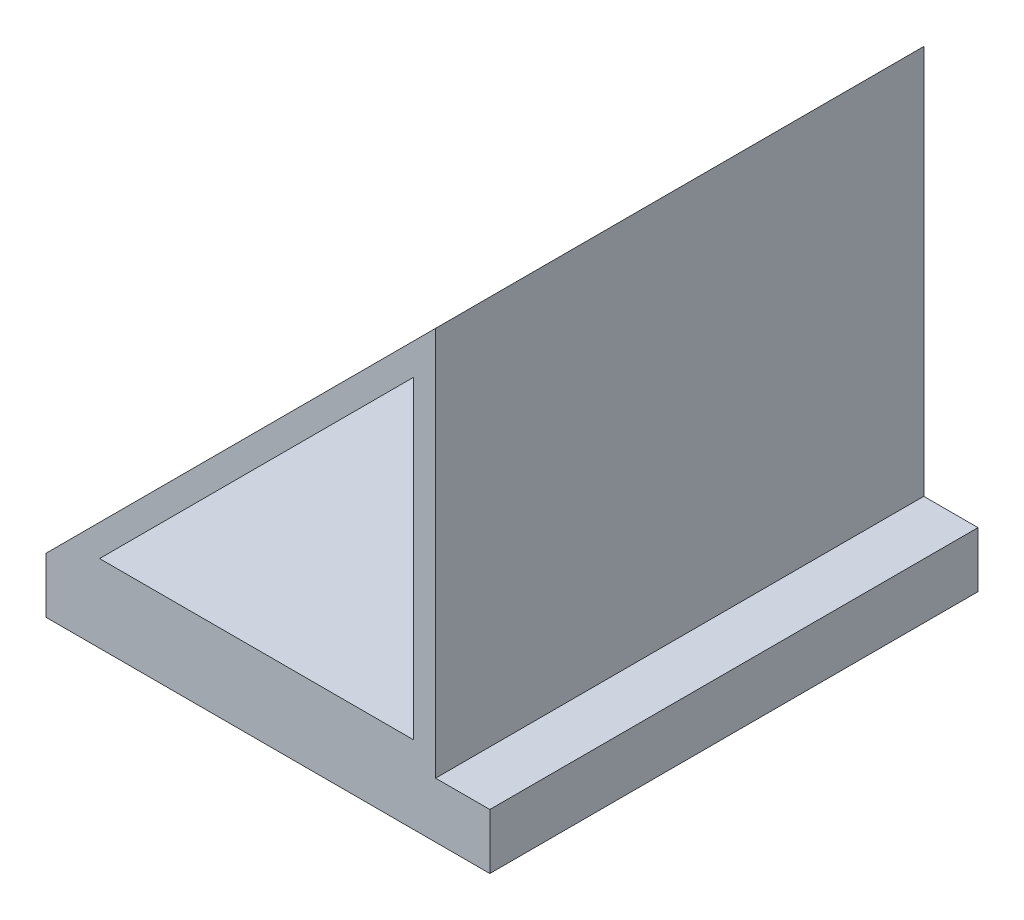
ISO-10303-21;
HEADER;
FILE_DESCRIPTION(('STEP AP214'),'2;1');
FILE_NAME('part.step','',(''),(''),'','','');
FILE_SCHEMA(('AUTOMOTIVE_DESIGN { 1 0 10303 214 1 1 1 1 }'));
ENDSEC;
DATA;
#1=APPLICATION_CONTEXT('core data for automotive mechanical design processes');
#2=APPLICATION_PROTOCOL_DEFINITION('international standard','automotive_design',2000,#1);
#3=PRODUCT_CONTEXT('',#1,'mechanical');
#4=PRODUCT('Part','Part','',(#3));
#5=PRODUCT_RELATED_PRODUCT_CATEGORY('part','',(#4));
#6=PRODUCT_DEFINITION_FORMATION('','',#4);
#7=PRODUCT_DEFINITION_CONTEXT('part definition',#1,'design');
#8=PRODUCT_DEFINITION('design','',#6,#7);
#9=PRODUCT_DEFINITION_SHAPE('','',#8);
#10=(LENGTH_UNIT() NAMED_UNIT(*) SI_UNIT(.MILLI.,.METRE.));
#11=(NAMED_UNIT(*) PLANE_ANGLE_UNIT() SI_UNIT($,.RADIAN.));
#12=(NAMED_UNIT(*) SI_UNIT($,.STERADIAN.) SOLID_ANGLE_UNIT());
#13=UNCERTAINTY_MEASURE_WITH_UNIT(LENGTH_MEASURE(1.E-05),#10,'distance_accuracy_value','');
#14=(GEOMETRIC_REPRESENTATION_CONTEXT(3) GLOBAL_UNCERTAINTY_ASSIGNED_CONTEXT((#13)) GLOBAL_UNIT_ASSIGNED_CONTEXT((#10,
#11,#12)) REPRESENTATION_CONTEXT('',''));
#15=CARTESIAN_POINT('',(0.,0.,0.));
#16=DIRECTION('',(0.,0.,1.));
#17=DIRECTION('',(1.,0.,0.));
#18=AXIS2_PLACEMENT_3D('',#15,#16,#17);
#19=CARTESIAN_POINT('',(0.,0.,44.));
#20=DIRECTION('',(0.,0.,-1.));
#21=DIRECTION('',(-1.,0.,0.));
#22=AXIS2_PLACEMENT_3D('',#19,#20,#21);
#23=PLANE('',#22);
#24=DIRECTION('',(0.,1.,0.));
#25=VECTOR('',#24,1.);
#26=CARTESIAN_POINT('',(2.,-30.2842712474621,44.));
#27=LINE('',#26,#25);
#28=CARTESIAN_POINT('',(2.,-30.2842712474621,44.));
#29=VERTEX_POINT('',#28);
#30=CARTESIAN_POINT('',(2.,4.82842712474623,44.));
#31=VERTEX_POINT('',#30);
#32=EDGE_CURVE('E194',#29,#31,#27,.T.);
#33=ORIENTED_EDGE('',*,*,#32,.T.);
#34=DIRECTION('',(-0.707106781186544,-0.707106781186551,0.));
#35=VECTOR('',#34,1.);
#36=CARTESIAN_POINT('',(2.,4.82842712474623,44.));
#37=LINE('',#36,#35);
#38=CARTESIAN_POINT('',(-33.1126983722079,-30.2842712474621,44.));
#39=VERTEX_POINT('',#38);
#40=EDGE_CURVE('E197',#31,#39,#37,.T.);
#41=ORIENTED_EDGE('',*,*,#40,.T.);
#42=DIRECTION('',(0.,1.,0.));
#43=VECTOR('',#42,1.);
#44=CARTESIAN_POINT('',(-33.1126983722079,-30.2842712474621,44.));
#45=LINE('',#44,#43);
#46=CARTESIAN_POINT('',(-33.1126983722079,-35.2842712474621,44.));
#47=VERTEX_POINT('',#46);
#48=EDGE_CURVE('E134',#47,#39,#45,.T.);
#49=ORIENTED_EDGE('',*,*,#48,.F.);
#50=DIRECTION('',(-1.,0.,0.));
#51=VECTOR('',#50,1.);
#52=CARTESIAN_POINT('',(-33.1126983722079,-35.2842712474621,44.));
#53=LINE('',#52,#51);
#54=CARTESIAN_POINT('',(6.8873016277921,-35.2842712474621,44.));
#55=VERTEX_POINT('',#54);
#56=EDGE_CURVE('E113',#55,#47,#53,.T.);
#57=ORIENTED_EDGE('',*,*,#56,.F.);
#58=DIRECTION('',(0.,-1.,0.));
#59=VECTOR('',#58,1.);
#60=CARTESIAN_POINT('',(6.8873016277921,-30.2842712474621,44.));
#61=LINE('',#60,#59);
#62=CARTESIAN_POINT('',(6.8873016277921,-30.2842712474621,44.));
#63=VERTEX_POINT('',#62);
#64=EDGE_CURVE('E144',#63,#55,#61,.T.);
#65=ORIENTED_EDGE('',*,*,#64,.F.);
#66=DIRECTION('',(1.,0.,0.));
#67=VECTOR('',#66,1.);
#68=CARTESIAN_POINT('',(-33.1126983722079,-30.2842712474621,44.));
#69=LINE('',#68,#67);
#70=EDGE_CURVE('E116',#29,#63,#69,.T.);
#71=ORIENTED_EDGE('',*,*,#70,.F.);
#72=EDGE_LOOP('',(#33,#41,#49,#57,#65,#71));
#73=FACE_BOUND('',#72,.T.);
#74=DIRECTION('',(0.,1.,0.));
#75=VECTOR('',#74,1.);
#76=CARTESIAN_POINT('',(0.,-28.2842712474621,44.));
#77=LINE('',#76,#75);
#78=CARTESIAN_POINT('',(0.,-28.2842712474621,44.));
#79=VERTEX_POINT('',#78);
#80=CARTESIAN_POINT('',(0.,0.,44.));
#81=VERTEX_POINT('',#80);
#82=EDGE_CURVE('E175',#79,#81,#77,.T.);
#83=ORIENTED_EDGE('',*,*,#82,.F.);
#84=DIRECTION('',(1.,0.,0.));
#85=VECTOR('',#84,1.);
#86=CARTESIAN_POINT('',(-28.2842712474617,-28.2842712474621,44.));
#87=LINE('',#86,#85);
#88=CARTESIAN_POINT('',(-28.2842712474617,-28.2842712474621,44.));
#89=VERTEX_POINT('',#88);
#90=EDGE_CURVE('E180',#89,#79,#87,.T.);
#91=ORIENTED_EDGE('',*,*,#90,.F.);
#92=DIRECTION('',(-0.707106781186544,-0.707106781186551,0.));
#93=VECTOR('',#92,1.);
#94=CARTESIAN_POINT('',(0.,0.,44.));
#95=LINE('',#94,#93);
#96=EDGE_CURVE('E177',#81,#89,#95,.T.);
#97=ORIENTED_EDGE('',*,*,#96,.F.);
#98=EDGE_LOOP('',(#83,#91,#97));
#99=FACE_BOUND('',#98,.T.);
#100=ADVANCED_FACE('F33',(#73,#99),#23,.F.);
#101=CARTESIAN_POINT('',(0.,0.,0.));
#102=DIRECTION('',(0.,0.,-1.));
#103=DIRECTION('',(-1.,0.,0.));
#104=AXIS2_PLACEMENT_3D('',#101,#102,#103);
#105=PLANE('',#104);
#106=DIRECTION('',(0.,1.,0.));
#107=VECTOR('',#106,1.);
#108=CARTESIAN_POINT('',(2.,-30.2842712474621,0.));
#109=LINE('',#108,#107);
#110=CARTESIAN_POINT('',(2.,-30.2842712474621,0.));
#111=VERTEX_POINT('',#110);
#112=CARTESIAN_POINT('',(2.,4.82842712474623,0.));
#113=VERTEX_POINT('',#112);
#114=EDGE_CURVE('E193',#111,#113,#109,.T.);
#115=ORIENTED_EDGE('',*,*,#114,.F.);
#116=DIRECTION('',(-1.,0.,0.));
#117=VECTOR('',#116,1.);
#118=CARTESIAN_POINT('',(-33.1126983722079,-30.2842712474621,0.));
#119=LINE('',#118,#117);
#120=CARTESIAN_POINT('',(6.8873016277921,-30.2842712474621,0.));
#121=VERTEX_POINT('',#120);
#122=EDGE_CURVE('E138',#121,#111,#119,.T.);
#123=ORIENTED_EDGE('',*,*,#122,.F.);
#124=DIRECTION('',(0.,1.,0.));
#125=VECTOR('',#124,1.);
#126=CARTESIAN_POINT('',(6.8873016277921,-30.2842712474621,0.));
#127=LINE('',#126,#125);
#128=CARTESIAN_POINT('',(6.8873016277921,-35.2842712474621,0.));
#129=VERTEX_POINT('',#128);
#130=EDGE_CURVE('E128',#129,#121,#127,.T.);
#131=ORIENTED_EDGE('',*,*,#130,.F.);
#132=DIRECTION('',(1.,0.,0.));
#133=VECTOR('',#132,1.);
#134=CARTESIAN_POINT('',(-33.1126983722079,-35.2842712474621,0.));
#135=LINE('',#134,#133);
#136=CARTESIAN_POINT('',(-33.1126983722079,-35.2842712474621,0.));
#137=VERTEX_POINT('',#136);
#138=EDGE_CURVE('E111',#137,#129,#135,.T.);
#139=ORIENTED_EDGE('',*,*,#138,.F.);
#140=DIRECTION('',(0.,-1.,0.));
#141=VECTOR('',#140,1.);
#142=CARTESIAN_POINT('',(-33.1126983722079,-30.2842712474621,0.));
#143=LINE('',#142,#141);
#144=CARTESIAN_POINT('',(-33.1126983722079,-30.2842712474621,0.));
#145=VERTEX_POINT('',#144);
#146=EDGE_CURVE('E124',#145,#137,#143,.T.);
#147=ORIENTED_EDGE('',*,*,#146,.F.);
#148=DIRECTION('',(-0.707106781186544,-0.707106781186551,0.));
#149=VECTOR('',#148,1.);
#150=CARTESIAN_POINT('',(2.,4.82842712474623,0.));
#151=LINE('',#150,#149);
#152=EDGE_CURVE('E198',#113,#145,#151,.T.);
#153=ORIENTED_EDGE('',*,*,#152,.F.);
#154=EDGE_LOOP('',(#115,#123,#131,#139,#147,#153));
#155=FACE_BOUND('',#154,.T.);
#156=DIRECTION('',(1.,0.,0.));
#157=VECTOR('',#156,1.);
#158=CARTESIAN_POINT('',(-28.2842712474617,-28.2842712474621,0.));
#159=LINE('',#158,#157);
#160=CARTESIAN_POINT('',(-28.2842712474617,-28.2842712474621,0.));
#161=VERTEX_POINT('',#160);
#162=CARTESIAN_POINT('',(0.,-28.2842712474621,0.));
#163=VERTEX_POINT('',#162);
#164=EDGE_CURVE('E178',#161,#163,#159,.T.);
#165=ORIENTED_EDGE('',*,*,#164,.T.);
#166=DIRECTION('',(0.,1.,0.));
#167=VECTOR('',#166,1.);
#168=CARTESIAN_POINT('',(0.,-28.2842712474621,0.));
#169=LINE('',#168,#167);
#170=CARTESIAN_POINT('',(0.,0.,0.));
#171=VERTEX_POINT('',#170);
#172=EDGE_CURVE('E56',#163,#171,#169,.T.);
#173=ORIENTED_EDGE('',*,*,#172,.T.);
#174=DIRECTION('',(-0.707106781186544,-0.707106781186551,0.));
#175=VECTOR('',#174,1.);
#176=CARTESIAN_POINT('',(0.,0.,0.));
#177=LINE('',#176,#175);
#178=EDGE_CURVE('E184',#171,#161,#177,.T.);
#179=ORIENTED_EDGE('',*,*,#178,.T.);
#180=EDGE_LOOP('',(#165,#173,#179));
#181=FACE_BOUND('',#180,.T.);
#182=ADVANCED_FACE('F122',(#155,#181),#105,.T.);
#183=CARTESIAN_POINT('',(2.,-30.2842712474621,44.));
#184=DIRECTION('',(-1.,0.,0.));
#185=DIRECTION('',(0.,0.,1.));
#186=AXIS2_PLACEMENT_3D('',#183,#184,#185);
#187=PLANE('',#186);
#188=ORIENTED_EDGE('',*,*,#114,.T.);
#189=DIRECTION('',(0.,0.,-1.));
#190=VECTOR('',#189,1.);
#191=CARTESIAN_POINT('',(2.,4.82842712474623,44.));
#192=LINE('',#191,#190);
#193=EDGE_CURVE('E11',#31,#113,#192,.T.);
#194=ORIENTED_EDGE('',*,*,#193,.F.);
#195=ORIENTED_EDGE('',*,*,#32,.F.);
#196=DIRECTION('',(0.,0.,-1.));
#197=VECTOR('',#196,1.);
#198=CARTESIAN_POINT('',(2.,-30.2842712474621,44.));
#199=LINE('',#198,#197);
#200=EDGE_CURVE('E201',#29,#111,#199,.T.);
#201=ORIENTED_EDGE('',*,*,#200,.T.);
#202=EDGE_LOOP('',(#188,#194,#195,#201));
#203=FACE_BOUND('',#202,.T.);
#204=ADVANCED_FACE('F35',(#203),#187,.F.);
#205=CARTESIAN_POINT('',(2.,4.82842712474623,44.));
#206=DIRECTION('',(0.707106781186551,-0.707106781186544,0.));
#207=DIRECTION('',(0.707106781186544,0.707106781186551,0.));
#208=AXIS2_PLACEMENT_3D('',#205,#206,#207);
#209=PLANE('',#208);
#210=CARTESIAN_POINT('',(-4.24264068711928,-1.41421356237312,38.));
#211=DIRECTION('',(-0.707106781186551,0.707106781186544,0.));
#212=DIRECTION('',(-0.707106781186544,-0.707106781186551,0.));
#213=AXIS2_PLACEMENT_3D('',#210,#211,#212);
#214=CIRCLE('',#213,1.5);
#215=CARTESIAN_POINT('',(-5.3033008588991,-2.47487373415295,38.));
#216=VERTEX_POINT('',#215);
#217=EDGE_CURVE('E152',#216,#216,#214,.T.);
#218=ORIENTED_EDGE('',*,*,#217,.F.);
#219=EDGE_LOOP('',(#218));
#220=FACE_BOUND('',#219,.T.);
#221=CARTESIAN_POINT('',(-15.556349186104,-12.7279220613579,22.));
#222=DIRECTION('',(-0.707106781186551,0.707106781186544,0.));
#223=DIRECTION('',(-0.707106781186544,-0.707106781186551,0.));
#224=AXIS2_PLACEMENT_3D('',#221,#222,#223);
#225=CIRCLE('',#224,17.);
#226=CARTESIAN_POINT('',(-27.5771644662752,-24.7487373415293,22.));
#227=VERTEX_POINT('',#226);
#228=EDGE_CURVE('E148',#227,#227,#225,.T.);
#229=ORIENTED_EDGE('',*,*,#228,.F.);
#230=EDGE_LOOP('',(#229));
#231=FACE_BOUND('',#230,.T.);
#232=CARTESIAN_POINT('',(-26.8700576850887,-24.0416305603428,38.));
#233=DIRECTION('',(-0.707106781186551,0.707106781186544,0.));
#234=DIRECTION('',(-0.707106781186544,-0.707106781186551,0.));
#235=AXIS2_PLACEMENT_3D('',#232,#233,#234);
#236=CIRCLE('',#235,1.5);
#237=CARTESIAN_POINT('',(-27.9307178568685,-25.1022907321226,38.));
#238=VERTEX_POINT('',#237);
#239=EDGE_CURVE('E165',#238,#238,#236,.T.);
#240=ORIENTED_EDGE('',*,*,#239,.F.);
#241=EDGE_LOOP('',(#240));
#242=FACE_BOUND('',#241,.T.);
#243=CARTESIAN_POINT('',(-4.24264068711928,-1.41421356237312,5.99999999999999));
#244=DIRECTION('',(-0.707106781186551,0.707106781186544,0.));
#245=DIRECTION('',(-0.707106781186544,-0.707106781186551,0.));
#246=AXIS2_PLACEMENT_3D('',#243,#244,#245);
#247=CIRCLE('',#246,1.5);
#248=CARTESIAN_POINT('',(-5.30330085889909,-2.47487373415294,5.99999999999999));
#249=VERTEX_POINT('',#248);
#250=EDGE_CURVE('E158',#249,#249,#247,.T.);
#251=ORIENTED_EDGE('',*,*,#250,.F.);
#252=EDGE_LOOP('',(#251));
#253=FACE_BOUND('',#252,.T.);
#254=CARTESIAN_POINT('',(-26.8700576850887,-24.0416305603428,5.99999999999999));
#255=DIRECTION('',(-0.707106781186551,0.707106781186544,0.));
#256=DIRECTION('',(-0.707106781186544,-0.707106781186551,0.));
#257=AXIS2_PLACEMENT_3D('',#254,#255,#256);
#258=CIRCLE('',#257,1.5);
#259=CARTESIAN_POINT('',(-27.9307178568685,-25.1022907321226,5.99999999999999));
#260=VERTEX_POINT('',#259);
#261=EDGE_CURVE('E172',#260,#260,#258,.T.);
#262=ORIENTED_EDGE('',*,*,#261,.F.);
#263=EDGE_LOOP('',(#262));
#264=FACE_BOUND('',#263,.T.);
#265=ORIENTED_EDGE('',*,*,#152,.T.);
#266=DIRECTION('',(0.,0.,-1.));
#267=VECTOR('',#266,1.);
#268=CARTESIAN_POINT('',(-33.1126983722079,-30.2842712474621,44.));
#269=LINE('',#268,#267);
#270=EDGE_CURVE('E41',#39,#145,#269,.T.);
#271=ORIENTED_EDGE('',*,*,#270,.F.);
#272=ORIENTED_EDGE('',*,*,#40,.F.);
#273=ORIENTED_EDGE('',*,*,#193,.T.);
#274=EDGE_LOOP('',(#265,#271,#272,#273));
#275=FACE_BOUND('',#274,.T.);
#276=ADVANCED_FACE('F212',(#220,#231,#242,#253,#264,#275),#209,.F.);
#277=CARTESIAN_POINT('',(0.,-28.2842712474621,44.));
#278=DIRECTION('',(-1.,0.,0.));
#279=DIRECTION('',(0.,0.,1.));
#280=AXIS2_PLACEMENT_3D('',#277,#278,#279);
#281=PLANE('',#280);
#282=ORIENTED_EDGE('',*,*,#172,.F.);
#283=DIRECTION('',(0.,0.,-1.));
#284=VECTOR('',#283,1.);
#285=CARTESIAN_POINT('',(0.,-28.2842712474621,44.));
#286=LINE('',#285,#284);
#287=EDGE_CURVE('E182',#79,#163,#286,.T.);
#288=ORIENTED_EDGE('',*,*,#287,.F.);
#289=ORIENTED_EDGE('',*,*,#82,.T.);
#290=DIRECTION('',(0.,0.,-1.));
#291=VECTOR('',#290,1.);
#292=CARTESIAN_POINT('',(0.,0.,44.));
#293=LINE('',#292,#291);
#294=EDGE_CURVE('E191',#81,#171,#293,.T.);
#295=ORIENTED_EDGE('',*,*,#294,.T.);
#296=EDGE_LOOP('',(#282,#288,#289,#295));
#297=FACE_BOUND('',#296,.T.);
#298=ADVANCED_FACE('F238',(#297),#281,.T.);
#299=CARTESIAN_POINT('',(0.,0.,44.));
#300=DIRECTION('',(0.707106781186551,-0.707106781186544,0.));
#301=DIRECTION('',(0.707106781186544,0.707106781186551,0.));
#302=AXIS2_PLACEMENT_3D('',#299,#300,#301);
#303=PLANE('',#302);
#304=CARTESIAN_POINT('',(-2.82842712474618,-2.8284271247462,38.));
#305=DIRECTION('',(0.707106781186551,-0.707106781186544,0.));
#306=DIRECTION('',(0.707106781186544,0.707106781186551,0.));
#307=AXIS2_PLACEMENT_3D('',#304,#305,#306);
#308=CIRCLE('',#307,1.5);
#309=CARTESIAN_POINT('',(-1.76776695296636,-1.76776695296637,38.));
#310=VERTEX_POINT('',#309);
#311=EDGE_CURVE('E151',#310,#310,#308,.F.);
#312=ORIENTED_EDGE('',*,*,#311,.T.);
#313=EDGE_LOOP('',(#312));
#314=FACE_BOUND('',#313,.T.);
#315=CARTESIAN_POINT('',(-14.1421356237309,-14.142135623731,22.));
#316=DIRECTION('',(0.707106781186551,-0.707106781186544,0.));
#317=DIRECTION('',(0.707106781186544,0.707106781186551,0.));
#318=AXIS2_PLACEMENT_3D('',#315,#316,#317);
#319=CIRCLE('',#318,17.);
#320=CARTESIAN_POINT('',(-2.12132034355963,-2.12132034355965,22.));
#321=VERTEX_POINT('',#320);
#322=EDGE_CURVE('E145',#321,#321,#319,.F.);
#323=ORIENTED_EDGE('',*,*,#322,.T.);
#324=EDGE_LOOP('',(#323));
#325=FACE_BOUND('',#324,.T.);
#326=CARTESIAN_POINT('',(-25.4558441227156,-25.4558441227158,38.));
#327=DIRECTION('',(0.707106781186551,-0.707106781186544,0.));
#328=DIRECTION('',(0.707106781186544,0.707106781186551,0.));
#329=AXIS2_PLACEMENT_3D('',#326,#327,#328);
#330=CIRCLE('',#329,1.5);
#331=CARTESIAN_POINT('',(-24.3951839509358,-24.395183950936,38.));
#332=VERTEX_POINT('',#331);
#333=EDGE_CURVE('E155',#332,#332,#330,.F.);
#334=ORIENTED_EDGE('',*,*,#333,.T.);
#335=EDGE_LOOP('',(#334));
#336=FACE_BOUND('',#335,.T.);
#337=CARTESIAN_POINT('',(-2.82842712474618,-2.8284271247462,5.99999999999999));
#338=DIRECTION('',(0.707106781186551,-0.707106781186544,0.));
#339=DIRECTION('',(0.707106781186544,0.707106781186551,0.));
#340=AXIS2_PLACEMENT_3D('',#337,#338,#339);
#341=CIRCLE('',#340,1.5);
#342=CARTESIAN_POINT('',(-1.76776695296636,-1.76776695296637,5.99999999999999));
#343=VERTEX_POINT('',#342);
#344=EDGE_CURVE('E162',#343,#343,#341,.F.);
#345=ORIENTED_EDGE('',*,*,#344,.T.);
#346=EDGE_LOOP('',(#345));
#347=FACE_BOUND('',#346,.T.);
#348=CARTESIAN_POINT('',(-25.4558441227156,-25.4558441227158,5.99999999999999));
#349=DIRECTION('',(0.707106781186551,-0.707106781186544,0.));
#350=DIRECTION('',(0.707106781186544,0.707106781186551,0.));
#351=AXIS2_PLACEMENT_3D('',#348,#349,#350);
#352=CIRCLE('',#351,1.5);
#353=CARTESIAN_POINT('',(-24.3951839509358,-24.395183950936,5.99999999999999));
#354=VERTEX_POINT('',#353);
#355=EDGE_CURVE('E161',#354,#354,#352,.F.);
#356=ORIENTED_EDGE('',*,*,#355,.T.);
#357=EDGE_LOOP('',(#356));
#358=FACE_BOUND('',#357,.T.);
#359=ORIENTED_EDGE('',*,*,#178,.F.);
#360=ORIENTED_EDGE('',*,*,#294,.F.);
#361=ORIENTED_EDGE('',*,*,#96,.T.);
#362=DIRECTION('',(0.,0.,-1.));
#363=VECTOR('',#362,1.);
#364=CARTESIAN_POINT('',(-28.2842712474617,-28.2842712474621,44.));
#365=LINE('',#364,#363);
#366=EDGE_CURVE('E48',#89,#161,#365,.T.);
#367=ORIENTED_EDGE('',*,*,#366,.T.);
#368=EDGE_LOOP('',(#359,#360,#361,#367));
#369=FACE_BOUND('',#368,.T.);
#370=ADVANCED_FACE('F246',(#314,#325,#336,#347,#358,#369),#303,.T.);
#371=CARTESIAN_POINT('',(-28.2842712474617,-28.2842712474621,44.));
#372=DIRECTION('',(0.,1.,0.));
#373=DIRECTION('',(0.,0.,1.));
#374=AXIS2_PLACEMENT_3D('',#371,#372,#373);
#375=PLANE('',#374);
#376=ORIENTED_EDGE('',*,*,#164,.F.);
#377=ORIENTED_EDGE('',*,*,#366,.F.);
#378=ORIENTED_EDGE('',*,*,#90,.T.);
#379=ORIENTED_EDGE('',*,*,#287,.T.);
#380=EDGE_LOOP('',(#376,#377,#378,#379));
#381=FACE_BOUND('',#380,.T.);
#382=ADVANCED_FACE('F260',(#381),#375,.T.);
#383=CARTESIAN_POINT('',(-9.31270849898454,-41.5989797464467,5.99999999999999));
#384=DIRECTION('',(-0.707106781186551,0.707106781186544,0.));
#385=DIRECTION('',(-0.707106781186544,-0.707106781186551,0.));
#386=AXIS2_PLACEMENT_3D('',#383,#384,#385);
#387=CYLINDRICAL_SURFACE('',#386,1.5);
#388=ORIENTED_EDGE('',*,*,#355,.F.);
#389=EDGE_LOOP('',(#388));
#390=FACE_BOUND('',#389,.T.);
#391=ORIENTED_EDGE('',*,*,#261,.T.);
#392=EDGE_LOOP('',(#391));
#393=FACE_BOUND('',#392,.T.);
#394=ADVANCED_FACE('F257',(#390,#393),#387,.F.);
#395=CARTESIAN_POINT('',(13.3147084989849,-18.9715627484771,5.99999999999999));
#396=DIRECTION('',(-0.707106781186551,0.707106781186544,0.));
#397=DIRECTION('',(-0.707106781186544,-0.707106781186551,0.));
#398=AXIS2_PLACEMENT_3D('',#395,#396,#397);
#399=CYLINDRICAL_SURFACE('',#398,1.5);
#400=ORIENTED_EDGE('',*,*,#344,.F.);
#401=EDGE_LOOP('',(#400));
#402=FACE_BOUND('',#401,.T.);
#403=ORIENTED_EDGE('',*,*,#250,.T.);
#404=EDGE_LOOP('',(#403));
#405=FACE_BOUND('',#404,.T.);
#406=ADVANCED_FACE('F259',(#402,#405),#399,.F.);
#407=CARTESIAN_POINT('',(-9.31270849898454,-41.5989797464467,38.));
#408=DIRECTION('',(-0.707106781186551,0.707106781186544,0.));
#409=DIRECTION('',(-0.707106781186544,-0.707106781186551,0.));
#410=AXIS2_PLACEMENT_3D('',#407,#408,#409);
#411=CYLINDRICAL_SURFACE('',#410,1.5);
#412=ORIENTED_EDGE('',*,*,#333,.F.);
#413=EDGE_LOOP('',(#412));
#414=FACE_BOUND('',#413,.T.);
#415=ORIENTED_EDGE('',*,*,#239,.T.);
#416=EDGE_LOOP('',(#415));
#417=FACE_BOUND('',#416,.T.);
#418=ADVANCED_FACE('F267',(#414,#417),#411,.F.);
#419=CARTESIAN_POINT('',(2.00100000000016,-30.2852712474619,22.));
#420=DIRECTION('',(-0.707106781186551,0.707106781186544,0.));
#421=DIRECTION('',(-0.707106781186544,-0.707106781186551,0.));
#422=AXIS2_PLACEMENT_3D('',#419,#420,#421);
#423=CYLINDRICAL_SURFACE('',#422,17.);
#424=ORIENTED_EDGE('',*,*,#322,.F.);
#425=EDGE_LOOP('',(#424));
#426=FACE_BOUND('',#425,.T.);
#427=ORIENTED_EDGE('',*,*,#228,.T.);
#428=EDGE_LOOP('',(#427));
#429=FACE_BOUND('',#428,.T.);
#430=ADVANCED_FACE('F294',(#426,#429),#423,.F.);
#431=CARTESIAN_POINT('',(13.3147084989849,-18.9715627484771,38.));
#432=DIRECTION('',(-0.707106781186551,0.707106781186544,0.));
#433=DIRECTION('',(-0.707106781186544,-0.707106781186551,0.));
#434=AXIS2_PLACEMENT_3D('',#431,#432,#433);
#435=CYLINDRICAL_SURFACE('',#434,1.5);
#436=ORIENTED_EDGE('',*,*,#311,.F.);
#437=EDGE_LOOP('',(#436));
#438=FACE_BOUND('',#437,.T.);
#439=ORIENTED_EDGE('',*,*,#217,.T.);
#440=EDGE_LOOP('',(#439));
#441=FACE_BOUND('',#440,.T.);
#442=ADVANCED_FACE('F229',(#438,#441),#435,.F.);
#443=CARTESIAN_POINT('',(-33.1126983722079,-30.2842712474621,84.3112887414928));
#444=DIRECTION('',(0.,-1.,0.));
#445=DIRECTION('',(0.,0.,-1.));
#446=AXIS2_PLACEMENT_3D('',#443,#444,#445);
#447=PLANE('',#446);
#448=ORIENTED_EDGE('',*,*,#200,.F.);
#449=ORIENTED_EDGE('',*,*,#70,.T.);
#450=DIRECTION('',(0.,0.,-1.));
#451=VECTOR('',#450,1.);
#452=CARTESIAN_POINT('',(6.8873016277921,-30.2842712474621,84.3112887414928));
#453=LINE('',#452,#451);
#454=EDGE_CURVE('E140',#63,#121,#453,.T.);
#455=ORIENTED_EDGE('',*,*,#454,.T.);
#456=ORIENTED_EDGE('',*,*,#122,.T.);
#457=EDGE_LOOP('',(#448,#449,#455,#456));
#458=FACE_BOUND('',#457,.T.);
#459=ADVANCED_FACE('F218',(#458),#447,.F.);
#460=CARTESIAN_POINT('',(6.8873016277921,-30.2842712474621,84.3112887414928));
#461=DIRECTION('',(-1.,0.,0.));
#462=DIRECTION('',(0.,0.,1.));
#463=AXIS2_PLACEMENT_3D('',#460,#461,#462);
#464=PLANE('',#463);
#465=ORIENTED_EDGE('',*,*,#454,.F.);
#466=ORIENTED_EDGE('',*,*,#64,.T.);
#467=DIRECTION('',(0.,0.,-1.));
#468=VECTOR('',#467,1.);
#469=CARTESIAN_POINT('',(6.8873016277921,-35.2842712474621,84.3112887414928));
#470=LINE('',#469,#468);
#471=EDGE_CURVE('E117',#55,#129,#470,.T.);
#472=ORIENTED_EDGE('',*,*,#471,.T.);
#473=ORIENTED_EDGE('',*,*,#130,.T.);
#474=EDGE_LOOP('',(#465,#466,#472,#473));
#475=FACE_BOUND('',#474,.T.);
#476=ADVANCED_FACE('F220',(#475),#464,.F.);
#477=CARTESIAN_POINT('',(-33.1126983722079,-35.2842712474621,84.3112887414928));
#478=DIRECTION('',(0.,1.,0.));
#479=DIRECTION('',(0.,0.,1.));
#480=AXIS2_PLACEMENT_3D('',#477,#478,#479);
#481=PLANE('',#480);
#482=ORIENTED_EDGE('',*,*,#471,.F.);
#483=ORIENTED_EDGE('',*,*,#56,.T.);
#484=DIRECTION('',(0.,0.,-1.));
#485=VECTOR('',#484,1.);
#486=CARTESIAN_POINT('',(-33.1126983722079,-35.2842712474621,84.3112887414928));
#487=LINE('',#486,#485);
#488=EDGE_CURVE('E107',#47,#137,#487,.T.);
#489=ORIENTED_EDGE('',*,*,#488,.T.);
#490=ORIENTED_EDGE('',*,*,#138,.T.);
#491=EDGE_LOOP('',(#482,#483,#489,#490));
#492=FACE_BOUND('',#491,.T.);
#493=ADVANCED_FACE('F110',(#492),#481,.F.);
#494=CARTESIAN_POINT('',(-33.1126983722079,-30.2842712474621,84.3112887414928));
#495=DIRECTION('',(1.,0.,0.));
#496=DIRECTION('',(0.,0.,-1.));
#497=AXIS2_PLACEMENT_3D('',#494,#495,#496);
#498=PLANE('',#497);
#499=ORIENTED_EDGE('',*,*,#488,.F.);
#500=ORIENTED_EDGE('',*,*,#48,.T.);
#501=ORIENTED_EDGE('',*,*,#270,.T.);
#502=ORIENTED_EDGE('',*,*,#146,.T.);
#503=EDGE_LOOP('',(#499,#500,#501,#502));
#504=FACE_BOUND('',#503,.T.);
#505=ADVANCED_FACE('F130',(#504),#498,.F.);
#506=CLOSED_SHELL('',(#100,#182,#204,#276,#298,#370,#382,#394,#406,#418,#430,#442,#459,#476,
#493,#505));
#507=MANIFOLD_SOLID_BREP('B2',#506);
#508=ADVANCED_BREP_SHAPE_REPRESENTATION('',(#18,#507),#14);
#509=SHAPE_DEFINITION_REPRESENTATION(#9,#508);
ENDSEC;
END-ISO-10303-21;
